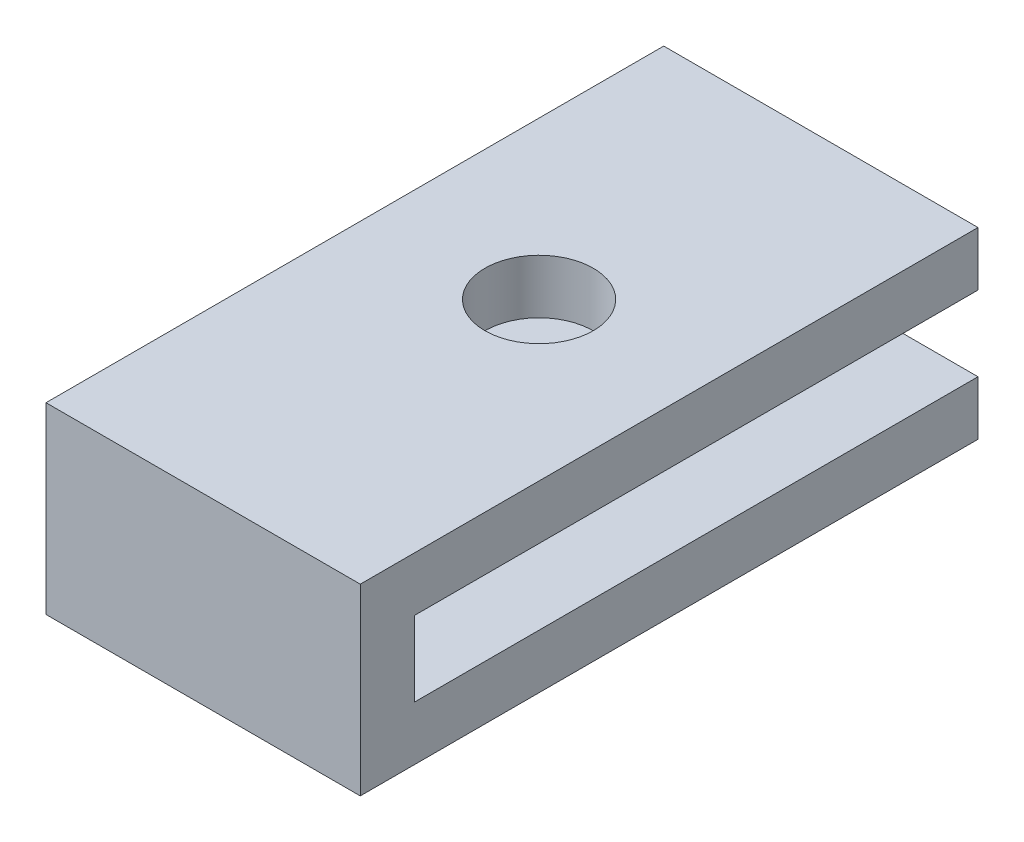
ISO-10303-21;
HEADER;
FILE_DESCRIPTION(('STEP AP214'),'2;1');
FILE_NAME('part.step','',(''),(''),'','','');
FILE_SCHEMA(('AUTOMOTIVE_DESIGN { 1 0 10303 214 1 1 1 1 }'));
ENDSEC;
DATA;
#1=APPLICATION_CONTEXT('core data for automotive mechanical design processes');
#2=APPLICATION_PROTOCOL_DEFINITION('international standard','automotive_design',2000,#1);
#3=PRODUCT_CONTEXT('',#1,'mechanical');
#4=PRODUCT('Part','Part','',(#3));
#5=PRODUCT_RELATED_PRODUCT_CATEGORY('part','',(#4));
#6=PRODUCT_DEFINITION_FORMATION('','',#4);
#7=PRODUCT_DEFINITION_CONTEXT('part definition',#1,'design');
#8=PRODUCT_DEFINITION('design','',#6,#7);
#9=PRODUCT_DEFINITION_SHAPE('','',#8);
#10=(LENGTH_UNIT() NAMED_UNIT(*) SI_UNIT(.MILLI.,.METRE.));
#11=(NAMED_UNIT(*) PLANE_ANGLE_UNIT() SI_UNIT($,.RADIAN.));
#12=(NAMED_UNIT(*) SI_UNIT($,.STERADIAN.) SOLID_ANGLE_UNIT());
#13=UNCERTAINTY_MEASURE_WITH_UNIT(LENGTH_MEASURE(1.E-05),#10,'distance_accuracy_value','');
#14=(GEOMETRIC_REPRESENTATION_CONTEXT(3) GLOBAL_UNCERTAINTY_ASSIGNED_CONTEXT((#13)) GLOBAL_UNIT_ASSIGNED_CONTEXT((#10,
#11,#12)) REPRESENTATION_CONTEXT('',''));
#15=CARTESIAN_POINT('',(0.,0.,0.));
#16=DIRECTION('',(0.,0.,1.));
#17=DIRECTION('',(1.,0.,0.));
#18=AXIS2_PLACEMENT_3D('',#15,#16,#17);
#19=CARTESIAN_POINT('',(0.,8.5979,-26.416));
#20=DIRECTION('',(0.,0.,1.));
#21=DIRECTION('',(1.,0.,0.));
#22=AXIS2_PLACEMENT_3D('',#19,#20,#21);
#23=PLANE('',#22);
#24=DIRECTION('',(0.,-1.,0.));
#25=VECTOR('',#24,1.);
#26=CARTESIAN_POINT('',(0.,8.5979,-26.416));
#27=LINE('',#26,#25);
#28=CARTESIAN_POINT('',(0.,2.54,-26.416));
#29=VERTEX_POINT('',#28);
#30=CARTESIAN_POINT('',(0.,0.,-26.416));
#31=VERTEX_POINT('',#30);
#32=EDGE_CURVE('E73',#29,#31,#27,.T.);
#33=ORIENTED_EDGE('',*,*,#32,.F.);
#34=DIRECTION('',(1.,0.,0.));
#35=VECTOR('',#34,1.);
#36=CARTESIAN_POINT('',(-10.668,2.54,-26.416));
#37=LINE('',#36,#35);
#38=CARTESIAN_POINT('',(14.732,2.54,-26.416));
#39=VERTEX_POINT('',#38);
#40=EDGE_CURVE('E113',#29,#39,#37,.T.);
#41=ORIENTED_EDGE('',*,*,#40,.T.);
#42=DIRECTION('',(0.,-1.,0.));
#43=VECTOR('',#42,1.);
#44=CARTESIAN_POINT('',(14.732,8.5979,-26.416));
#45=LINE('',#44,#43);
#46=CARTESIAN_POINT('',(14.732,0.,-26.416));
#47=VERTEX_POINT('',#46);
#48=EDGE_CURVE('E42',#39,#47,#45,.T.);
#49=ORIENTED_EDGE('',*,*,#48,.T.);
#50=DIRECTION('',(-1.,0.,0.));
#51=VECTOR('',#50,1.);
#52=CARTESIAN_POINT('',(0.,0.,-26.416));
#53=LINE('',#52,#51);
#54=EDGE_CURVE('E89',#47,#31,#53,.T.);
#55=ORIENTED_EDGE('',*,*,#54,.T.);
#56=EDGE_LOOP('',(#33,#41,#49,#55));
#57=FACE_BOUND('',#56,.T.);
#58=ADVANCED_FACE('F33',(#57),#23,.F.);
#59=CARTESIAN_POINT('',(7.366,8.5979,-13.208));
#60=DIRECTION('',(0.,-1.,0.));
#61=DIRECTION('',(0.,0.,-1.));
#62=AXIS2_PLACEMENT_3D('',#59,#60,#61);
#63=CYLINDRICAL_SURFACE('',#62,2.54);
#64=CARTESIAN_POINT('',(7.366,2.54,-13.208));
#65=DIRECTION('',(0.,-1.,0.));
#66=DIRECTION('',(0.,0.,-1.));
#67=AXIS2_PLACEMENT_3D('',#64,#65,#66);
#68=CIRCLE('',#67,2.54);
#69=CARTESIAN_POINT('',(7.366,2.54,-15.748));
#70=VERTEX_POINT('',#69);
#71=EDGE_CURVE('E37',#70,#70,#68,.T.);
#72=ORIENTED_EDGE('',*,*,#71,.F.);
#73=EDGE_LOOP('',(#72));
#74=FACE_BOUND('',#73,.T.);
#75=CARTESIAN_POINT('',(7.366,0.,-13.208));
#76=DIRECTION('',(0.,1.,0.));
#77=DIRECTION('',(0.,0.,1.));
#78=AXIS2_PLACEMENT_3D('',#75,#76,#77);
#79=CIRCLE('',#78,2.54);
#80=CARTESIAN_POINT('',(7.366,0.,-10.668));
#81=VERTEX_POINT('',#80);
#82=EDGE_CURVE('E106',#81,#81,#79,.T.);
#83=ORIENTED_EDGE('',*,*,#82,.F.);
#84=EDGE_LOOP('',(#83));
#85=FACE_BOUND('',#84,.T.);
#86=ADVANCED_FACE('F205',(#74,#85),#63,.F.);
#87=CARTESIAN_POINT('',(0.,8.5979,0.));
#88=DIRECTION('',(0.,-1.,0.));
#89=DIRECTION('',(0.,0.,-1.));
#90=AXIS2_PLACEMENT_3D('',#87,#88,#89);
#91=PLANE('',#90);
#92=DIRECTION('',(0.,0.,1.));
#93=VECTOR('',#92,1.);
#94=CARTESIAN_POINT('',(0.,8.5979,0.));
#95=LINE('',#94,#93);
#96=CARTESIAN_POINT('',(0.,8.5979,-26.416));
#97=VERTEX_POINT('',#96);
#98=CARTESIAN_POINT('',(0.,8.5979,2.54));
#99=VERTEX_POINT('',#98);
#100=EDGE_CURVE('E94',#97,#99,#95,.T.);
#101=ORIENTED_EDGE('',*,*,#100,.T.);
#102=DIRECTION('',(-1.,0.,0.));
#103=VECTOR('',#102,1.);
#104=CARTESIAN_POINT('',(0.,8.5979,2.54));
#105=LINE('',#104,#103);
#106=CARTESIAN_POINT('',(14.732,8.5979,2.54));
#107=VERTEX_POINT('',#106);
#108=EDGE_CURVE('E141',#107,#99,#105,.T.);
#109=ORIENTED_EDGE('',*,*,#108,.F.);
#110=DIRECTION('',(0.,0.,-1.));
#111=VECTOR('',#110,1.);
#112=CARTESIAN_POINT('',(14.732,8.5979,0.));
#113=LINE('',#112,#111);
#114=CARTESIAN_POINT('',(14.732,8.5979,-26.416));
#115=VERTEX_POINT('',#114);
#116=EDGE_CURVE('E146',#107,#115,#113,.T.);
#117=ORIENTED_EDGE('',*,*,#116,.T.);
#118=DIRECTION('',(-1.,0.,0.));
#119=VECTOR('',#118,1.);
#120=CARTESIAN_POINT('',(0.,8.5979,-26.416));
#121=LINE('',#120,#119);
#122=EDGE_CURVE('E59',#115,#97,#121,.T.);
#123=ORIENTED_EDGE('',*,*,#122,.T.);
#124=EDGE_LOOP('',(#101,#109,#117,#123));
#125=FACE_BOUND('',#124,.T.);
#126=CARTESIAN_POINT('',(7.366,8.5979,-13.208));
#127=DIRECTION('',(0.,1.,0.));
#128=DIRECTION('',(0.,0.,1.));
#129=AXIS2_PLACEMENT_3D('',#126,#127,#128);
#130=CIRCLE('',#129,2.54);
#131=CARTESIAN_POINT('',(7.366,8.5979,-10.668));
#132=VERTEX_POINT('',#131);
#133=EDGE_CURVE('E102',#132,#132,#130,.T.);
#134=ORIENTED_EDGE('',*,*,#133,.F.);
#135=EDGE_LOOP('',(#134));
#136=FACE_BOUND('',#135,.T.);
#137=ADVANCED_FACE('F150',(#125,#136),#91,.F.);
#138=CARTESIAN_POINT('',(0.,0.,0.));
#139=DIRECTION('',(0.,-1.,0.));
#140=DIRECTION('',(0.,0.,-1.));
#141=AXIS2_PLACEMENT_3D('',#138,#139,#140);
#142=PLANE('',#141);
#143=DIRECTION('',(0.,0.,1.));
#144=VECTOR('',#143,1.);
#145=CARTESIAN_POINT('',(0.,0.,0.));
#146=LINE('',#145,#144);
#147=CARTESIAN_POINT('',(0.,0.,2.54));
#148=VERTEX_POINT('',#147);
#149=EDGE_CURVE('E79',#31,#148,#146,.T.);
#150=ORIENTED_EDGE('',*,*,#149,.F.);
#151=ORIENTED_EDGE('',*,*,#54,.F.);
#152=DIRECTION('',(0.,0.,-1.));
#153=VECTOR('',#152,1.);
#154=CARTESIAN_POINT('',(14.732,0.,0.));
#155=LINE('',#154,#153);
#156=CARTESIAN_POINT('',(14.732,0.,2.54));
#157=VERTEX_POINT('',#156);
#158=EDGE_CURVE('E95',#157,#47,#155,.T.);
#159=ORIENTED_EDGE('',*,*,#158,.F.);
#160=DIRECTION('',(1.,0.,0.));
#161=VECTOR('',#160,1.);
#162=CARTESIAN_POINT('',(0.,0.,2.54));
#163=LINE('',#162,#161);
#164=EDGE_CURVE('E100',#148,#157,#163,.T.);
#165=ORIENTED_EDGE('',*,*,#164,.F.);
#166=EDGE_LOOP('',(#150,#151,#159,#165));
#167=FACE_BOUND('',#166,.T.);
#168=ORIENTED_EDGE('',*,*,#82,.T.);
#169=EDGE_LOOP('',(#168));
#170=FACE_BOUND('',#169,.T.);
#171=ADVANCED_FACE('F97',(#167,#170),#142,.T.);
#172=CARTESIAN_POINT('',(0.,8.5979,0.));
#173=DIRECTION('',(1.,0.,0.));
#174=DIRECTION('',(0.,0.,-1.));
#175=AXIS2_PLACEMENT_3D('',#172,#173,#174);
#176=PLANE('',#175);
#177=DIRECTION('',(0.,-1.,0.));
#178=VECTOR('',#177,1.);
#179=CARTESIAN_POINT('',(0.,8.5979,0.));
#180=LINE('',#179,#178);
#181=CARTESIAN_POINT('',(0.,6.0579,0.));
#182=VERTEX_POINT('',#181);
#183=CARTESIAN_POINT('',(0.,2.54,0.));
#184=VERTEX_POINT('',#183);
#185=EDGE_CURVE('E133',#182,#184,#180,.T.);
#186=ORIENTED_EDGE('',*,*,#185,.T.);
#187=DIRECTION('',(0.,0.,-1.));
#188=VECTOR('',#187,1.);
#189=CARTESIAN_POINT('',(0.,2.54,0.));
#190=LINE('',#189,#188);
#191=EDGE_CURVE('E83',#184,#29,#190,.T.);
#192=ORIENTED_EDGE('',*,*,#191,.T.);
#193=ORIENTED_EDGE('',*,*,#32,.T.);
#194=ORIENTED_EDGE('',*,*,#149,.T.);
#195=DIRECTION('',(0.,-1.,0.));
#196=VECTOR('',#195,1.);
#197=CARTESIAN_POINT('',(0.,8.5979,2.54));
#198=LINE('',#197,#196);
#199=EDGE_CURVE('E135',#99,#148,#198,.T.);
#200=ORIENTED_EDGE('',*,*,#199,.F.);
#201=ORIENTED_EDGE('',*,*,#100,.F.);
#202=CARTESIAN_POINT('',(0.,6.0579,-26.416));
#203=VERTEX_POINT('',#202);
#204=EDGE_CURVE('E86',#97,#203,#27,.T.);
#205=ORIENTED_EDGE('',*,*,#204,.T.);
#206=DIRECTION('',(0.,0.,1.));
#207=VECTOR('',#206,1.);
#208=CARTESIAN_POINT('',(0.,6.0579,0.));
#209=LINE('',#208,#207);
#210=EDGE_CURVE('E50',#203,#182,#209,.T.);
#211=ORIENTED_EDGE('',*,*,#210,.T.);
#212=EDGE_LOOP('',(#186,#192,#193,#194,#200,#201,#205,#211));
#213=FACE_BOUND('',#212,.T.);
#214=ADVANCED_FACE('F35',(#213),#176,.F.);
#215=CARTESIAN_POINT('',(14.732,8.5979,0.));
#216=DIRECTION('',(-1.,0.,0.));
#217=DIRECTION('',(0.,0.,1.));
#218=AXIS2_PLACEMENT_3D('',#215,#216,#217);
#219=PLANE('',#218);
#220=ORIENTED_EDGE('',*,*,#48,.F.);
#221=DIRECTION('',(0.,0.,-1.));
#222=VECTOR('',#221,1.);
#223=CARTESIAN_POINT('',(14.732,2.54,-26.416));
#224=LINE('',#223,#222);
#225=CARTESIAN_POINT('',(14.732,2.54,0.));
#226=VERTEX_POINT('',#225);
#227=EDGE_CURVE('E125',#226,#39,#224,.T.);
#228=ORIENTED_EDGE('',*,*,#227,.F.);
#229=DIRECTION('',(0.,-1.,0.));
#230=VECTOR('',#229,1.);
#231=CARTESIAN_POINT('',(14.732,6.0579,0.));
#232=LINE('',#231,#230);
#233=CARTESIAN_POINT('',(14.732,6.0579,0.));
#234=VERTEX_POINT('',#233);
#235=EDGE_CURVE('E184',#234,#226,#232,.T.);
#236=ORIENTED_EDGE('',*,*,#235,.F.);
#237=DIRECTION('',(0.,0.,1.));
#238=VECTOR('',#237,1.);
#239=CARTESIAN_POINT('',(14.732,6.0579,-26.416));
#240=LINE('',#239,#238);
#241=CARTESIAN_POINT('',(14.732,6.0579,-26.416));
#242=VERTEX_POINT('',#241);
#243=EDGE_CURVE('E160',#242,#234,#240,.T.);
#244=ORIENTED_EDGE('',*,*,#243,.F.);
#245=EDGE_CURVE('E11',#115,#242,#45,.T.);
#246=ORIENTED_EDGE('',*,*,#245,.F.);
#247=ORIENTED_EDGE('',*,*,#116,.F.);
#248=DIRECTION('',(0.,1.,0.));
#249=VECTOR('',#248,1.);
#250=CARTESIAN_POINT('',(14.732,8.5979,2.54));
#251=LINE('',#250,#249);
#252=EDGE_CURVE('E138',#157,#107,#251,.T.);
#253=ORIENTED_EDGE('',*,*,#252,.F.);
#254=ORIENTED_EDGE('',*,*,#158,.T.);
#255=EDGE_LOOP('',(#220,#228,#236,#244,#246,#247,#253,#254));
#256=FACE_BOUND('',#255,.T.);
#257=ADVANCED_FACE('F156',(#256),#219,.F.);
#258=ORIENTED_EDGE('',*,*,#245,.T.);
#259=DIRECTION('',(1.,0.,0.));
#260=VECTOR('',#259,1.);
#261=CARTESIAN_POINT('',(-10.668,6.0579,-26.416));
#262=LINE('',#261,#260);
#263=EDGE_CURVE('E130',#203,#242,#262,.T.);
#264=ORIENTED_EDGE('',*,*,#263,.F.);
#265=ORIENTED_EDGE('',*,*,#204,.F.);
#266=ORIENTED_EDGE('',*,*,#122,.F.);
#267=EDGE_LOOP('',(#258,#264,#265,#266));
#268=FACE_BOUND('',#267,.T.);
#269=ADVANCED_FACE('F162',(#268),#23,.F.);
#270=CARTESIAN_POINT('',(7.366,6.0579,-13.208));
#271=DIRECTION('',(0.,1.,0.));
#272=DIRECTION('',(0.,0.,1.));
#273=AXIS2_PLACEMENT_3D('',#270,#271,#272);
#274=CIRCLE('',#273,2.54);
#275=CARTESIAN_POINT('',(7.366,6.0579,-10.668));
#276=VERTEX_POINT('',#275);
#277=EDGE_CURVE('E111',#276,#276,#274,.T.);
#278=ORIENTED_EDGE('',*,*,#277,.F.);
#279=EDGE_LOOP('',(#278));
#280=FACE_BOUND('',#279,.T.);
#281=ORIENTED_EDGE('',*,*,#133,.T.);
#282=EDGE_LOOP('',(#281));
#283=FACE_BOUND('',#282,.T.);
#284=ADVANCED_FACE('F201',(#280,#283),#63,.F.);
#285=CARTESIAN_POINT('',(0.,0.,2.54));
#286=DIRECTION('',(0.,0.,1.));
#287=DIRECTION('',(1.,0.,0.));
#288=AXIS2_PLACEMENT_3D('',#285,#286,#287);
#289=PLANE('',#288);
#290=ORIENTED_EDGE('',*,*,#199,.T.);
#291=ORIENTED_EDGE('',*,*,#164,.T.);
#292=ORIENTED_EDGE('',*,*,#252,.T.);
#293=ORIENTED_EDGE('',*,*,#108,.T.);
#294=EDGE_LOOP('',(#290,#291,#292,#293));
#295=FACE_BOUND('',#294,.T.);
#296=ADVANCED_FACE('F165',(#295),#289,.T.);
#297=CARTESIAN_POINT('',(-10.668,6.0579,0.));
#298=DIRECTION('',(0.,0.,1.));
#299=DIRECTION('',(0.,-1.,0.));
#300=AXIS2_PLACEMENT_3D('',#297,#298,#299);
#301=PLANE('',#300);
#302=DIRECTION('',(1.,0.,0.));
#303=VECTOR('',#302,1.);
#304=CARTESIAN_POINT('',(-10.668,6.0579,0.));
#305=LINE('',#304,#303);
#306=EDGE_CURVE('E122',#182,#234,#305,.T.);
#307=ORIENTED_EDGE('',*,*,#306,.T.);
#308=ORIENTED_EDGE('',*,*,#235,.T.);
#309=DIRECTION('',(1.,0.,0.));
#310=VECTOR('',#309,1.);
#311=CARTESIAN_POINT('',(-10.668,2.54,0.));
#312=LINE('',#311,#310);
#313=EDGE_CURVE('E117',#184,#226,#312,.T.);
#314=ORIENTED_EDGE('',*,*,#313,.F.);
#315=ORIENTED_EDGE('',*,*,#185,.F.);
#316=EDGE_LOOP('',(#307,#308,#314,#315));
#317=FACE_BOUND('',#316,.T.);
#318=ADVANCED_FACE('F192',(#317),#301,.F.);
#319=CARTESIAN_POINT('',(-10.668,2.54,-26.416));
#320=DIRECTION('',(0.,-1.,0.));
#321=DIRECTION('',(0.,0.,-1.));
#322=AXIS2_PLACEMENT_3D('',#319,#320,#321);
#323=PLANE('',#322);
#324=ORIENTED_EDGE('',*,*,#71,.T.);
#325=EDGE_LOOP('',(#324));
#326=FACE_BOUND('',#325,.T.);
#327=ORIENTED_EDGE('',*,*,#313,.T.);
#328=ORIENTED_EDGE('',*,*,#227,.T.);
#329=ORIENTED_EDGE('',*,*,#40,.F.);
#330=ORIENTED_EDGE('',*,*,#191,.F.);
#331=EDGE_LOOP('',(#327,#328,#329,#330));
#332=FACE_BOUND('',#331,.T.);
#333=ADVANCED_FACE('F191',(#326,#332),#323,.F.);
#334=CARTESIAN_POINT('',(-10.668,6.0579,-26.416));
#335=DIRECTION('',(0.,1.,0.));
#336=DIRECTION('',(0.,0.,1.));
#337=AXIS2_PLACEMENT_3D('',#334,#335,#336);
#338=PLANE('',#337);
#339=ORIENTED_EDGE('',*,*,#277,.T.);
#340=EDGE_LOOP('',(#339));
#341=FACE_BOUND('',#340,.T.);
#342=ORIENTED_EDGE('',*,*,#263,.T.);
#343=ORIENTED_EDGE('',*,*,#243,.T.);
#344=ORIENTED_EDGE('',*,*,#306,.F.);
#345=ORIENTED_EDGE('',*,*,#210,.F.);
#346=EDGE_LOOP('',(#342,#343,#344,#345));
#347=FACE_BOUND('',#346,.T.);
#348=ADVANCED_FACE('F183',(#341,#347),#338,.F.);
#349=CLOSED_SHELL('',(#58,#86,#137,#171,#214,#257,#269,#284,#296,#318,#333,#348));
#350=MANIFOLD_SOLID_BREP('B2',#349);
#351=ADVANCED_BREP_SHAPE_REPRESENTATION('',(#18,#350),#14);
#352=SHAPE_DEFINITION_REPRESENTATION(#9,#351);
ENDSEC;
END-ISO-10303-21;
